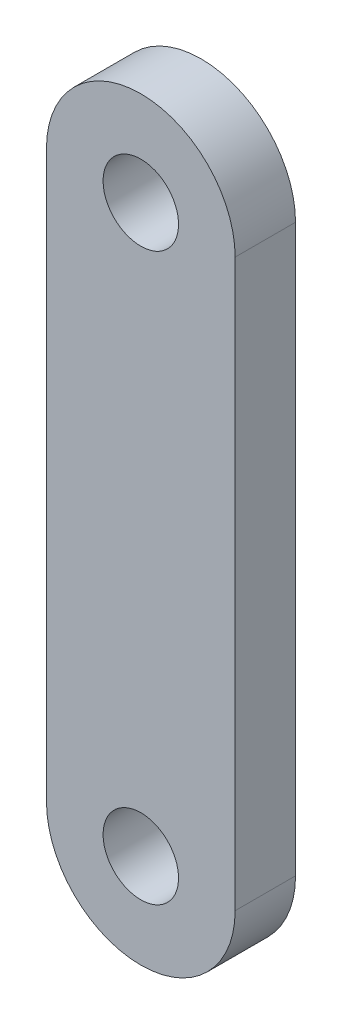
ISO-10303-21;
HEADER;
FILE_DESCRIPTION(('STEP AP214'),'2;1');
FILE_NAME('part.step','',(''),(''),'','','');
FILE_SCHEMA(('AUTOMOTIVE_DESIGN { 1 0 10303 214 1 1 1 1 }'));
ENDSEC;
DATA;
#1=APPLICATION_CONTEXT('core data for automotive mechanical design processes');
#2=APPLICATION_PROTOCOL_DEFINITION('international standard','automotive_design',2000,#1);
#3=PRODUCT_CONTEXT('',#1,'mechanical');
#4=PRODUCT('Part','Part','',(#3));
#5=PRODUCT_RELATED_PRODUCT_CATEGORY('part','',(#4));
#6=PRODUCT_DEFINITION_FORMATION('','',#4);
#7=PRODUCT_DEFINITION_CONTEXT('part definition',#1,'design');
#8=PRODUCT_DEFINITION('design','',#6,#7);
#9=PRODUCT_DEFINITION_SHAPE('','',#8);
#10=(LENGTH_UNIT() NAMED_UNIT(*) SI_UNIT(.MILLI.,.METRE.));
#11=(NAMED_UNIT(*) PLANE_ANGLE_UNIT() SI_UNIT($,.RADIAN.));
#12=(NAMED_UNIT(*) SI_UNIT($,.STERADIAN.) SOLID_ANGLE_UNIT());
#13=UNCERTAINTY_MEASURE_WITH_UNIT(LENGTH_MEASURE(1.E-05),#10,'distance_accuracy_value','');
#14=(GEOMETRIC_REPRESENTATION_CONTEXT(3) GLOBAL_UNCERTAINTY_ASSIGNED_CONTEXT((#13)) GLOBAL_UNIT_ASSIGNED_CONTEXT((#10,
#11,#12)) REPRESENTATION_CONTEXT('',''));
#15=CARTESIAN_POINT('',(0.,0.,0.));
#16=DIRECTION('',(0.,0.,1.));
#17=DIRECTION('',(1.,0.,0.));
#18=AXIS2_PLACEMENT_3D('',#15,#16,#17);
#19=CARTESIAN_POINT('',(0.,-37.5,8.));
#20=DIRECTION('',(0.,0.,-1.));
#21=DIRECTION('',(-1.,0.,0.));
#22=AXIS2_PLACEMENT_3D('',#19,#20,#21);
#23=CYLINDRICAL_SURFACE('',#22,12.5);
#24=CARTESIAN_POINT('',(0.,-37.5,0.));
#25=DIRECTION('',(0.,0.,1.));
#26=DIRECTION('',(1.,0.,0.));
#27=AXIS2_PLACEMENT_3D('',#24,#25,#26);
#28=CIRCLE('',#27,12.5);
#29=CARTESIAN_POINT('',(-12.5,-37.5,0.));
#30=VERTEX_POINT('',#29);
#31=CARTESIAN_POINT('',(12.5,-37.5,0.));
#32=VERTEX_POINT('',#31);
#33=EDGE_CURVE('E108',#30,#32,#28,.T.);
#34=ORIENTED_EDGE('',*,*,#33,.T.);
#35=DIRECTION('',(0.,0.,-1.));
#36=VECTOR('',#35,1.);
#37=CARTESIAN_POINT('',(12.5,-37.5,8.));
#38=LINE('',#37,#36);
#39=CARTESIAN_POINT('',(12.5,-37.5,8.));
#40=VERTEX_POINT('',#39);
#41=EDGE_CURVE('E11',#40,#32,#38,.T.);
#42=ORIENTED_EDGE('',*,*,#41,.F.);
#43=CARTESIAN_POINT('',(0.,-37.5,8.));
#44=DIRECTION('',(0.,0.,1.));
#45=DIRECTION('',(1.,0.,0.));
#46=AXIS2_PLACEMENT_3D('',#43,#44,#45);
#47=CIRCLE('',#46,12.5);
#48=CARTESIAN_POINT('',(-12.5,-37.5,8.));
#49=VERTEX_POINT('',#48);
#50=EDGE_CURVE('E92',#49,#40,#47,.T.);
#51=ORIENTED_EDGE('',*,*,#50,.F.);
#52=DIRECTION('',(0.,0.,-1.));
#53=VECTOR('',#52,1.);
#54=CARTESIAN_POINT('',(-12.5,-37.5,8.));
#55=LINE('',#54,#53);
#56=EDGE_CURVE('E65',#49,#30,#55,.T.);
#57=ORIENTED_EDGE('',*,*,#56,.T.);
#58=EDGE_LOOP('',(#34,#42,#51,#57));
#59=FACE_BOUND('',#58,.T.);
#60=ADVANCED_FACE('F46',(#59),#23,.T.);
#61=CARTESIAN_POINT('',(12.5,-37.5,8.));
#62=DIRECTION('',(-1.,0.,0.));
#63=DIRECTION('',(0.,-1.,0.));
#64=AXIS2_PLACEMENT_3D('',#61,#62,#63);
#65=PLANE('',#64);
#66=DIRECTION('',(0.,1.,0.));
#67=VECTOR('',#66,1.);
#68=CARTESIAN_POINT('',(12.5,-37.5,0.));
#69=LINE('',#68,#67);
#70=CARTESIAN_POINT('',(12.5,37.5,0.));
#71=VERTEX_POINT('',#70);
#72=EDGE_CURVE('E99',#32,#71,#69,.T.);
#73=ORIENTED_EDGE('',*,*,#72,.T.);
#74=DIRECTION('',(0.,0.,-1.));
#75=VECTOR('',#74,1.);
#76=CARTESIAN_POINT('',(12.5,37.5,8.));
#77=LINE('',#76,#75);
#78=CARTESIAN_POINT('',(12.5,37.5,8.));
#79=VERTEX_POINT('',#78);
#80=EDGE_CURVE('E53',#79,#71,#77,.T.);
#81=ORIENTED_EDGE('',*,*,#80,.F.);
#82=DIRECTION('',(0.,1.,0.));
#83=VECTOR('',#82,1.);
#84=CARTESIAN_POINT('',(12.5,-37.5,8.));
#85=LINE('',#84,#83);
#86=EDGE_CURVE('E86',#40,#79,#85,.T.);
#87=ORIENTED_EDGE('',*,*,#86,.F.);
#88=ORIENTED_EDGE('',*,*,#41,.T.);
#89=EDGE_LOOP('',(#73,#81,#87,#88));
#90=FACE_BOUND('',#89,.T.);
#91=ADVANCED_FACE('F97',(#90),#65,.F.);
#92=CARTESIAN_POINT('',(0.,37.5,8.));
#93=DIRECTION('',(0.,0.,-1.));
#94=DIRECTION('',(-1.,0.,0.));
#95=AXIS2_PLACEMENT_3D('',#92,#93,#94);
#96=CYLINDRICAL_SURFACE('',#95,12.5);
#97=CARTESIAN_POINT('',(0.,37.5,0.));
#98=DIRECTION('',(0.,0.,1.));
#99=DIRECTION('',(1.,0.,0.));
#100=AXIS2_PLACEMENT_3D('',#97,#98,#99);
#101=CIRCLE('',#100,12.5);
#102=CARTESIAN_POINT('',(-12.5,37.5,0.));
#103=VERTEX_POINT('',#102);
#104=EDGE_CURVE('E114',#71,#103,#101,.T.);
#105=ORIENTED_EDGE('',*,*,#104,.T.);
#106=DIRECTION('',(0.,0.,-1.));
#107=VECTOR('',#106,1.);
#108=CARTESIAN_POINT('',(-12.5,37.5,8.));
#109=LINE('',#108,#107);
#110=CARTESIAN_POINT('',(-12.5,37.5,8.));
#111=VERTEX_POINT('',#110);
#112=EDGE_CURVE('E80',#111,#103,#109,.T.);
#113=ORIENTED_EDGE('',*,*,#112,.F.);
#114=CARTESIAN_POINT('',(0.,37.5,8.));
#115=DIRECTION('',(0.,0.,1.));
#116=DIRECTION('',(1.,0.,0.));
#117=AXIS2_PLACEMENT_3D('',#114,#115,#116);
#118=CIRCLE('',#117,12.5);
#119=EDGE_CURVE('E94',#79,#111,#118,.T.);
#120=ORIENTED_EDGE('',*,*,#119,.F.);
#121=ORIENTED_EDGE('',*,*,#80,.T.);
#122=EDGE_LOOP('',(#105,#113,#120,#121));
#123=FACE_BOUND('',#122,.T.);
#124=ADVANCED_FACE('F103',(#123),#96,.T.);
#125=CARTESIAN_POINT('',(-12.5,-37.5,8.));
#126=DIRECTION('',(-1.,0.,0.));
#127=DIRECTION('',(0.,-1.,0.));
#128=AXIS2_PLACEMENT_3D('',#125,#126,#127);
#129=PLANE('',#128);
#130=DIRECTION('',(0.,1.,0.));
#131=VECTOR('',#130,1.);
#132=CARTESIAN_POINT('',(-12.5,-37.5,0.));
#133=LINE('',#132,#131);
#134=EDGE_CURVE('E113',#30,#103,#133,.T.);
#135=ORIENTED_EDGE('',*,*,#134,.F.);
#136=ORIENTED_EDGE('',*,*,#56,.F.);
#137=DIRECTION('',(0.,1.,0.));
#138=VECTOR('',#137,1.);
#139=CARTESIAN_POINT('',(-12.5,-37.5,8.));
#140=LINE('',#139,#138);
#141=EDGE_CURVE('E102',#49,#111,#140,.T.);
#142=ORIENTED_EDGE('',*,*,#141,.T.);
#143=ORIENTED_EDGE('',*,*,#112,.T.);
#144=EDGE_LOOP('',(#135,#136,#142,#143));
#145=FACE_BOUND('',#144,.T.);
#146=ADVANCED_FACE('F150',(#145),#129,.T.);
#147=CARTESIAN_POINT('',(0.,-37.5,8.));
#148=DIRECTION('',(0.,0.,1.));
#149=DIRECTION('',(1.,0.,0.));
#150=AXIS2_PLACEMENT_3D('',#147,#148,#149);
#151=PLANE('',#150);
#152=CARTESIAN_POINT('',(0.,-37.5,8.));
#153=DIRECTION('',(0.,0.,-1.));
#154=DIRECTION('',(-1.,0.,0.));
#155=AXIS2_PLACEMENT_3D('',#152,#153,#154);
#156=CIRCLE('',#155,5.);
#157=CARTESIAN_POINT('',(-5.,-37.5,8.));
#158=VERTEX_POINT('',#157);
#159=EDGE_CURVE('E112',#158,#158,#156,.T.);
#160=ORIENTED_EDGE('',*,*,#159,.T.);
#161=EDGE_LOOP('',(#160));
#162=FACE_BOUND('',#161,.T.);
#163=CARTESIAN_POINT('',(0.,37.5,8.));
#164=DIRECTION('',(0.,0.,-1.));
#165=DIRECTION('',(-1.,0.,0.));
#166=AXIS2_PLACEMENT_3D('',#163,#164,#165);
#167=CIRCLE('',#166,5.);
#168=CARTESIAN_POINT('',(-5.,37.5,8.));
#169=VERTEX_POINT('',#168);
#170=EDGE_CURVE('E122',#169,#169,#167,.T.);
#171=ORIENTED_EDGE('',*,*,#170,.T.);
#172=EDGE_LOOP('',(#171));
#173=FACE_BOUND('',#172,.T.);
#174=ORIENTED_EDGE('',*,*,#50,.T.);
#175=ORIENTED_EDGE('',*,*,#86,.T.);
#176=ORIENTED_EDGE('',*,*,#119,.T.);
#177=ORIENTED_EDGE('',*,*,#141,.F.);
#178=EDGE_LOOP('',(#174,#175,#176,#177));
#179=FACE_BOUND('',#178,.T.);
#180=ADVANCED_FACE('F93',(#162,#173,#179),#151,.T.);
#181=CARTESIAN_POINT('',(0.,-37.5,0.));
#182=DIRECTION('',(0.,0.,1.));
#183=DIRECTION('',(1.,0.,0.));
#184=AXIS2_PLACEMENT_3D('',#181,#182,#183);
#185=PLANE('',#184);
#186=CARTESIAN_POINT('',(0.,-37.5,0.));
#187=DIRECTION('',(0.,0.,-1.));
#188=DIRECTION('',(-1.,0.,0.));
#189=AXIS2_PLACEMENT_3D('',#186,#187,#188);
#190=CIRCLE('',#189,5.);
#191=CARTESIAN_POINT('',(-5.,-37.5,0.));
#192=VERTEX_POINT('',#191);
#193=EDGE_CURVE('E130',#192,#192,#190,.T.);
#194=ORIENTED_EDGE('',*,*,#193,.F.);
#195=EDGE_LOOP('',(#194));
#196=FACE_BOUND('',#195,.T.);
#197=CARTESIAN_POINT('',(0.,37.5,0.));
#198=DIRECTION('',(0.,0.,-1.));
#199=DIRECTION('',(-1.,0.,0.));
#200=AXIS2_PLACEMENT_3D('',#197,#198,#199);
#201=CIRCLE('',#200,5.);
#202=CARTESIAN_POINT('',(-5.,37.5,0.));
#203=VERTEX_POINT('',#202);
#204=EDGE_CURVE('E121',#203,#203,#201,.T.);
#205=ORIENTED_EDGE('',*,*,#204,.F.);
#206=EDGE_LOOP('',(#205));
#207=FACE_BOUND('',#206,.T.);
#208=ORIENTED_EDGE('',*,*,#33,.F.);
#209=ORIENTED_EDGE('',*,*,#134,.T.);
#210=ORIENTED_EDGE('',*,*,#104,.F.);
#211=ORIENTED_EDGE('',*,*,#72,.F.);
#212=EDGE_LOOP('',(#208,#209,#210,#211));
#213=FACE_BOUND('',#212,.T.);
#214=ADVANCED_FACE('F142',(#196,#207,#213),#185,.F.);
#215=CARTESIAN_POINT('',(0.,37.5,8.));
#216=DIRECTION('',(0.,0.,-1.));
#217=DIRECTION('',(-1.,0.,0.));
#218=AXIS2_PLACEMENT_3D('',#215,#216,#217);
#219=CYLINDRICAL_SURFACE('',#218,5.);
#220=ORIENTED_EDGE('',*,*,#170,.F.);
#221=EDGE_LOOP('',(#220));
#222=FACE_BOUND('',#221,.T.);
#223=ORIENTED_EDGE('',*,*,#204,.T.);
#224=EDGE_LOOP('',(#223));
#225=FACE_BOUND('',#224,.T.);
#226=ADVANCED_FACE('F139',(#222,#225),#219,.F.);
#227=CARTESIAN_POINT('',(0.,-37.5,8.));
#228=DIRECTION('',(0.,0.,-1.));
#229=DIRECTION('',(-1.,0.,0.));
#230=AXIS2_PLACEMENT_3D('',#227,#228,#229);
#231=CYLINDRICAL_SURFACE('',#230,5.);
#232=ORIENTED_EDGE('',*,*,#159,.F.);
#233=EDGE_LOOP('',(#232));
#234=FACE_BOUND('',#233,.T.);
#235=ORIENTED_EDGE('',*,*,#193,.T.);
#236=EDGE_LOOP('',(#235));
#237=FACE_BOUND('',#236,.T.);
#238=ADVANCED_FACE('F133',(#234,#237),#231,.F.);
#239=CLOSED_SHELL('',(#60,#91,#124,#146,#180,#214,#226,#238));
#240=MANIFOLD_SOLID_BREP('B2',#239);
#241=ADVANCED_BREP_SHAPE_REPRESENTATION('',(#18,#240),#14);
#242=SHAPE_DEFINITION_REPRESENTATION(#9,#241);
ENDSEC;
END-ISO-10303-21;
